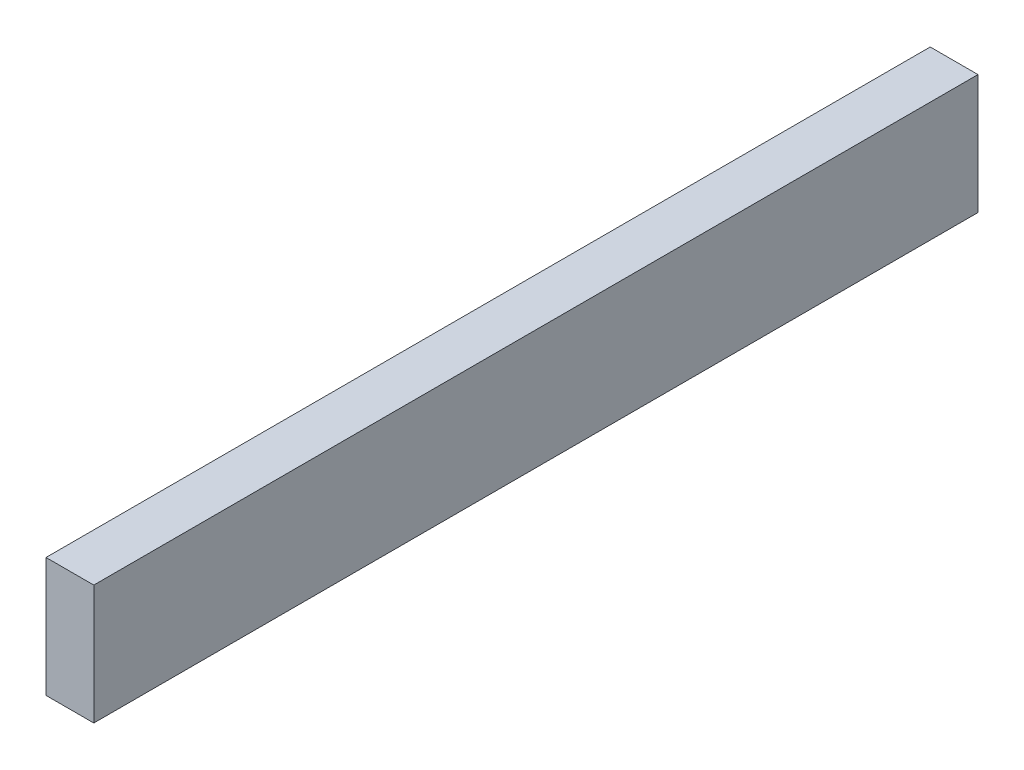
ISO-10303-21;
HEADER;
FILE_DESCRIPTION(('STEP AP214'),'2;1');
FILE_NAME('part.step','',(''),(''),'','','');
FILE_SCHEMA(('AUTOMOTIVE_DESIGN { 1 0 10303 214 1 1 1 1 }'));
ENDSEC;
DATA;
#1=APPLICATION_CONTEXT('core data for automotive mechanical design processes');
#2=APPLICATION_PROTOCOL_DEFINITION('international standard','automotive_design',2000,#1);
#3=PRODUCT_CONTEXT('',#1,'mechanical');
#4=PRODUCT('Part','Part','',(#3));
#5=PRODUCT_RELATED_PRODUCT_CATEGORY('part','',(#4));
#6=PRODUCT_DEFINITION_FORMATION('','',#4);
#7=PRODUCT_DEFINITION_CONTEXT('part definition',#1,'design');
#8=PRODUCT_DEFINITION('design','',#6,#7);
#9=PRODUCT_DEFINITION_SHAPE('','',#8);
#10=(LENGTH_UNIT() NAMED_UNIT(*) SI_UNIT(.MILLI.,.METRE.));
#11=(NAMED_UNIT(*) PLANE_ANGLE_UNIT() SI_UNIT($,.RADIAN.));
#12=(NAMED_UNIT(*) SI_UNIT($,.STERADIAN.) SOLID_ANGLE_UNIT());
#13=UNCERTAINTY_MEASURE_WITH_UNIT(LENGTH_MEASURE(1.E-05),#10,'distance_accuracy_value','');
#14=(GEOMETRIC_REPRESENTATION_CONTEXT(3) GLOBAL_UNCERTAINTY_ASSIGNED_CONTEXT((#13)) GLOBAL_UNIT_ASSIGNED_CONTEXT((#10,
#11,#12)) REPRESENTATION_CONTEXT('',''));
#15=CARTESIAN_POINT('',(0.,0.,0.));
#16=DIRECTION('',(0.,0.,1.));
#17=DIRECTION('',(1.,0.,0.));
#18=AXIS2_PLACEMENT_3D('',#15,#16,#17);
#19=CARTESIAN_POINT('',(10.,0.,0.));
#20=DIRECTION('',(0.,0.,-1.));
#21=DIRECTION('',(-1.,0.,0.));
#22=AXIS2_PLACEMENT_3D('',#19,#20,#21);
#23=PLANE('',#22);
#24=DIRECTION('',(0.,-1.,0.));
#25=VECTOR('',#24,1.);
#26=CARTESIAN_POINT('',(0.,0.,0.));
#27=LINE('',#26,#25);
#28=CARTESIAN_POINT('',(0.,25.,0.));
#29=VERTEX_POINT('',#28);
#30=CARTESIAN_POINT('',(0.,0.,0.));
#31=VERTEX_POINT('',#30);
#32=EDGE_CURVE('E119',#29,#31,#27,.T.);
#33=ORIENTED_EDGE('',*,*,#32,.T.);
#34=DIRECTION('',(-1.,0.,0.));
#35=VECTOR('',#34,1.);
#36=CARTESIAN_POINT('',(10.,0.,0.));
#37=LINE('',#36,#35);
#38=CARTESIAN_POINT('',(10.,0.,0.));
#39=VERTEX_POINT('',#38);
#40=EDGE_CURVE('E11',#39,#31,#37,.T.);
#41=ORIENTED_EDGE('',*,*,#40,.F.);
#42=DIRECTION('',(0.,-1.,0.));
#43=VECTOR('',#42,1.);
#44=CARTESIAN_POINT('',(10.,0.,0.));
#45=LINE('',#44,#43);
#46=CARTESIAN_POINT('',(10.,25.,0.));
#47=VERTEX_POINT('',#46);
#48=EDGE_CURVE('E101',#47,#39,#45,.T.);
#49=ORIENTED_EDGE('',*,*,#48,.F.);
#50=DIRECTION('',(-1.,0.,0.));
#51=VECTOR('',#50,1.);
#52=CARTESIAN_POINT('',(10.,25.,0.));
#53=LINE('',#52,#51);
#54=EDGE_CURVE('E115',#47,#29,#53,.T.);
#55=ORIENTED_EDGE('',*,*,#54,.T.);
#56=EDGE_LOOP('',(#33,#41,#49,#55));
#57=FACE_BOUND('',#56,.T.);
#58=ADVANCED_FACE('F49',(#57),#23,.F.);
#59=CARTESIAN_POINT('',(10.,0.,0.));
#60=DIRECTION('',(0.,1.,0.));
#61=DIRECTION('',(0.,0.,1.));
#62=AXIS2_PLACEMENT_3D('',#59,#60,#61);
#63=PLANE('',#62);
#64=DIRECTION('',(0.,0.,-1.));
#65=VECTOR('',#64,1.);
#66=CARTESIAN_POINT('',(0.,0.,0.));
#67=LINE('',#66,#65);
#68=CARTESIAN_POINT('',(0.,0.,-185.));
#69=VERTEX_POINT('',#68);
#70=EDGE_CURVE('E106',#31,#69,#67,.T.);
#71=ORIENTED_EDGE('',*,*,#70,.T.);
#72=DIRECTION('',(-1.,0.,0.));
#73=VECTOR('',#72,1.);
#74=CARTESIAN_POINT('',(10.,0.,-185.));
#75=LINE('',#74,#73);
#76=CARTESIAN_POINT('',(10.,0.,-185.));
#77=VERTEX_POINT('',#76);
#78=EDGE_CURVE('E58',#77,#69,#75,.T.);
#79=ORIENTED_EDGE('',*,*,#78,.F.);
#80=DIRECTION('',(0.,0.,-1.));
#81=VECTOR('',#80,1.);
#82=CARTESIAN_POINT('',(10.,0.,0.));
#83=LINE('',#82,#81);
#84=EDGE_CURVE('E96',#39,#77,#83,.T.);
#85=ORIENTED_EDGE('',*,*,#84,.F.);
#86=ORIENTED_EDGE('',*,*,#40,.T.);
#87=EDGE_LOOP('',(#71,#79,#85,#86));
#88=FACE_BOUND('',#87,.T.);
#89=ADVANCED_FACE('F105',(#88),#63,.F.);
#90=CARTESIAN_POINT('',(10.,0.,-185.));
#91=DIRECTION('',(0.,0.,1.));
#92=DIRECTION('',(1.,0.,0.));
#93=AXIS2_PLACEMENT_3D('',#90,#91,#92);
#94=PLANE('',#93);
#95=DIRECTION('',(0.,1.,0.));
#96=VECTOR('',#95,1.);
#97=CARTESIAN_POINT('',(0.,0.,-185.));
#98=LINE('',#97,#96);
#99=CARTESIAN_POINT('',(0.,25.,-185.));
#100=VERTEX_POINT('',#99);
#101=EDGE_CURVE('E83',#69,#100,#98,.T.);
#102=ORIENTED_EDGE('',*,*,#101,.T.);
#103=DIRECTION('',(-1.,0.,0.));
#104=VECTOR('',#103,1.);
#105=CARTESIAN_POINT('',(10.,25.,-185.));
#106=LINE('',#105,#104);
#107=CARTESIAN_POINT('',(10.,25.,-185.));
#108=VERTEX_POINT('',#107);
#109=EDGE_CURVE('E108',#108,#100,#106,.T.);
#110=ORIENTED_EDGE('',*,*,#109,.F.);
#111=DIRECTION('',(0.,1.,0.));
#112=VECTOR('',#111,1.);
#113=CARTESIAN_POINT('',(10.,0.,-185.));
#114=LINE('',#113,#112);
#115=EDGE_CURVE('E99',#77,#108,#114,.T.);
#116=ORIENTED_EDGE('',*,*,#115,.F.);
#117=ORIENTED_EDGE('',*,*,#78,.T.);
#118=EDGE_LOOP('',(#102,#110,#116,#117));
#119=FACE_BOUND('',#118,.T.);
#120=ADVANCED_FACE('F109',(#119),#94,.F.);
#121=CARTESIAN_POINT('',(10.,25.,0.));
#122=DIRECTION('',(0.,-1.,0.));
#123=DIRECTION('',(0.,0.,-1.));
#124=AXIS2_PLACEMENT_3D('',#121,#122,#123);
#125=PLANE('',#124);
#126=DIRECTION('',(0.,0.,1.));
#127=VECTOR('',#126,1.);
#128=CARTESIAN_POINT('',(0.,25.,0.));
#129=LINE('',#128,#127);
#130=EDGE_CURVE('E89',#100,#29,#129,.T.);
#131=ORIENTED_EDGE('',*,*,#130,.T.);
#132=ORIENTED_EDGE('',*,*,#54,.F.);
#133=DIRECTION('',(0.,0.,1.));
#134=VECTOR('',#133,1.);
#135=CARTESIAN_POINT('',(10.,25.,0.));
#136=LINE('',#135,#134);
#137=EDGE_CURVE('E66',#108,#47,#136,.T.);
#138=ORIENTED_EDGE('',*,*,#137,.F.);
#139=ORIENTED_EDGE('',*,*,#109,.T.);
#140=EDGE_LOOP('',(#131,#132,#138,#139));
#141=FACE_BOUND('',#140,.T.);
#142=ADVANCED_FACE('F134',(#141),#125,.F.);
#143=CARTESIAN_POINT('',(10.,0.,0.));
#144=DIRECTION('',(-1.,0.,0.));
#145=DIRECTION('',(0.,0.,1.));
#146=AXIS2_PLACEMENT_3D('',#143,#144,#145);
#147=PLANE('',#146);
#148=ORIENTED_EDGE('',*,*,#48,.T.);
#149=ORIENTED_EDGE('',*,*,#84,.T.);
#150=ORIENTED_EDGE('',*,*,#115,.T.);
#151=ORIENTED_EDGE('',*,*,#137,.T.);
#152=EDGE_LOOP('',(#148,#149,#150,#151));
#153=FACE_BOUND('',#152,.T.);
#154=ADVANCED_FACE('F97',(#153),#147,.F.);
#155=CARTESIAN_POINT('',(0.,0.,0.));
#156=DIRECTION('',(-1.,0.,0.));
#157=DIRECTION('',(0.,0.,1.));
#158=AXIS2_PLACEMENT_3D('',#155,#156,#157);
#159=PLANE('',#158);
#160=ORIENTED_EDGE('',*,*,#32,.F.);
#161=ORIENTED_EDGE('',*,*,#130,.F.);
#162=ORIENTED_EDGE('',*,*,#101,.F.);
#163=ORIENTED_EDGE('',*,*,#70,.F.);
#164=EDGE_LOOP('',(#160,#161,#162,#163));
#165=FACE_BOUND('',#164,.T.);
#166=ADVANCED_FACE('F137',(#165),#159,.T.);
#167=CLOSED_SHELL('',(#58,#89,#120,#142,#154,#166));
#168=MANIFOLD_SOLID_BREP('B2',#167);
#169=ADVANCED_BREP_SHAPE_REPRESENTATION('',(#18,#168),#14);
#170=SHAPE_DEFINITION_REPRESENTATION(#9,#169);
ENDSEC;
END-ISO-10303-21;
